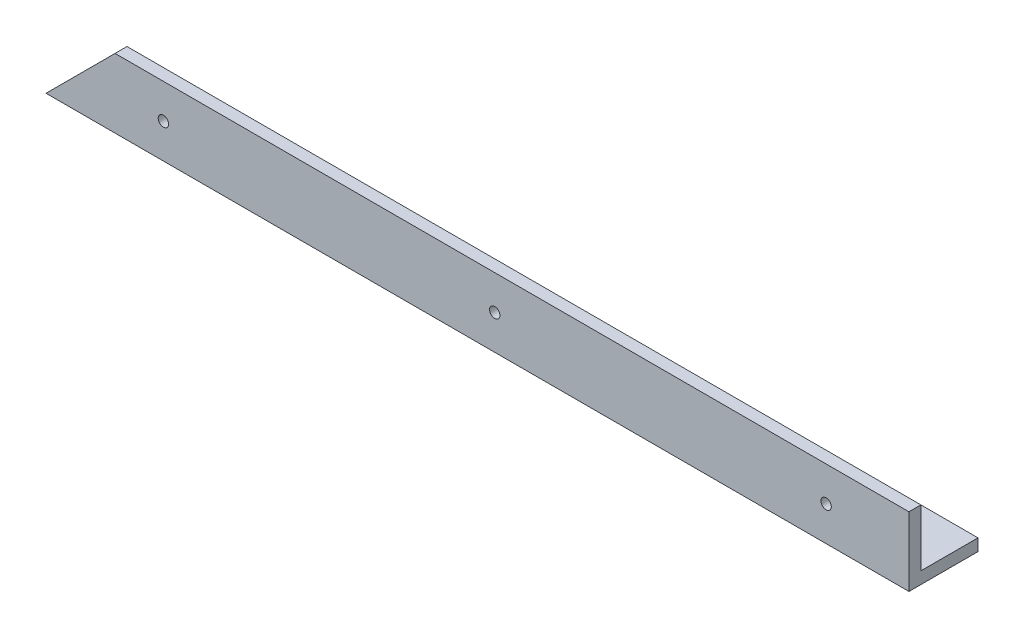
ISO-10303-21;
HEADER;
FILE_DESCRIPTION(('STEP AP214'),'2;1');
FILE_NAME('part.step','',(''),(''),'','','');
FILE_SCHEMA(('AUTOMOTIVE_DESIGN { 1 0 10303 214 1 1 1 1 }'));
ENDSEC;
DATA;
#1=APPLICATION_CONTEXT('core data for automotive mechanical design processes');
#2=APPLICATION_PROTOCOL_DEFINITION('international standard','automotive_design',2000,#1);
#3=PRODUCT_CONTEXT('',#1,'mechanical');
#4=PRODUCT('Part','Part','',(#3));
#5=PRODUCT_RELATED_PRODUCT_CATEGORY('part','',(#4));
#6=PRODUCT_DEFINITION_FORMATION('','',#4);
#7=PRODUCT_DEFINITION_CONTEXT('part definition',#1,'design');
#8=PRODUCT_DEFINITION('design','',#6,#7);
#9=PRODUCT_DEFINITION_SHAPE('','',#8);
#10=(LENGTH_UNIT() NAMED_UNIT(*) SI_UNIT(.MILLI.,.METRE.));
#11=(NAMED_UNIT(*) PLANE_ANGLE_UNIT() SI_UNIT($,.RADIAN.));
#12=(NAMED_UNIT(*) SI_UNIT($,.STERADIAN.) SOLID_ANGLE_UNIT());
#13=UNCERTAINTY_MEASURE_WITH_UNIT(LENGTH_MEASURE(1.E-05),#10,'distance_accuracy_value','');
#14=(GEOMETRIC_REPRESENTATION_CONTEXT(3) GLOBAL_UNCERTAINTY_ASSIGNED_CONTEXT((#13)) GLOBAL_UNIT_ASSIGNED_CONTEXT((#10,
#11,#12)) REPRESENTATION_CONTEXT('',''));
#15=CARTESIAN_POINT('',(0.,0.,0.));
#16=DIRECTION('',(0.,0.,1.));
#17=DIRECTION('',(1.,0.,0.));
#18=AXIS2_PLACEMENT_3D('',#15,#16,#17);
#19=CARTESIAN_POINT('',(250.,0.,-20.));
#20=DIRECTION('',(0.,0.,1.));
#21=DIRECTION('',(1.,0.,0.));
#22=AXIS2_PLACEMENT_3D('',#19,#20,#21);
#23=PLANE('',#22);
#24=DIRECTION('',(-1.,0.,0.));
#25=VECTOR('',#24,1.);
#26=CARTESIAN_POINT('',(250.,0.,-20.));
#27=LINE('',#26,#25);
#28=CARTESIAN_POINT('',(250.,0.,-20.));
#29=VERTEX_POINT('',#28);
#30=CARTESIAN_POINT('',(12.,0.,-20.));
#31=VERTEX_POINT('',#30);
#32=EDGE_CURVE('E107',#29,#31,#27,.T.);
#33=ORIENTED_EDGE('',*,*,#32,.T.);
#34=DIRECTION('',(0.,-1.,0.));
#35=VECTOR('',#34,1.);
#36=CARTESIAN_POINT('',(12.,20.,-20.));
#37=LINE('',#36,#35);
#38=CARTESIAN_POINT('',(12.,3.46117846701572,-20.));
#39=VERTEX_POINT('',#38);
#40=EDGE_CURVE('E94',#39,#31,#37,.T.);
#41=ORIENTED_EDGE('',*,*,#40,.F.);
#42=DIRECTION('',(-1.,0.,0.));
#43=VECTOR('',#42,1.);
#44=CARTESIAN_POINT('',(250.,3.46117846701572,-20.));
#45=LINE('',#44,#43);
#46=CARTESIAN_POINT('',(250.,3.46117846701572,-20.));
#47=VERTEX_POINT('',#46);
#48=EDGE_CURVE('E114',#47,#39,#45,.T.);
#49=ORIENTED_EDGE('',*,*,#48,.F.);
#50=DIRECTION('',(0.,1.,0.));
#51=VECTOR('',#50,1.);
#52=CARTESIAN_POINT('',(250.,0.,-20.));
#53=LINE('',#52,#51);
#54=EDGE_CURVE('E113',#29,#47,#53,.T.);
#55=ORIENTED_EDGE('',*,*,#54,.F.);
#56=EDGE_LOOP('',(#33,#41,#49,#55));
#57=FACE_BOUND('',#56,.T.);
#58=ADVANCED_FACE('F37',(#57),#23,.F.);
#59=CARTESIAN_POINT('',(250.,3.46117846701572,-20.));
#60=DIRECTION('',(0.,-1.,0.));
#61=DIRECTION('',(0.,0.,-1.));
#62=AXIS2_PLACEMENT_3D('',#59,#60,#61);
#63=PLANE('',#62);
#64=CARTESIAN_POINT('',(185.,3.46117846701572,-9.00000000000001));
#65=DIRECTION('',(0.,-1.,0.));
#66=DIRECTION('',(0.,0.,-1.));
#67=AXIS2_PLACEMENT_3D('',#64,#65,#66);
#68=CIRCLE('',#67,1.5);
#69=CARTESIAN_POINT('',(185.,3.46117846701572,-10.5));
#70=VERTEX_POINT('',#69);
#71=EDGE_CURVE('E184',#70,#70,#68,.T.);
#72=ORIENTED_EDGE('',*,*,#71,.T.);
#73=EDGE_LOOP('',(#72));
#74=FACE_BOUND('',#73,.T.);
#75=CARTESIAN_POINT('',(107.,3.46117846701572,-8.99999999999999));
#76=DIRECTION('',(0.,-1.,0.));
#77=DIRECTION('',(0.,0.,-1.));
#78=AXIS2_PLACEMENT_3D('',#75,#76,#77);
#79=CIRCLE('',#78,1.5);
#80=CARTESIAN_POINT('',(107.,3.46117846701572,-10.5));
#81=VERTEX_POINT('',#80);
#82=EDGE_CURVE('E193',#81,#81,#79,.T.);
#83=ORIENTED_EDGE('',*,*,#82,.T.);
#84=EDGE_LOOP('',(#83));
#85=FACE_BOUND('',#84,.T.);
#86=CARTESIAN_POINT('',(29.0000000000002,3.46117846701572,-8.99999999999999));
#87=DIRECTION('',(0.,-1.,0.));
#88=DIRECTION('',(0.,0.,-1.));
#89=AXIS2_PLACEMENT_3D('',#86,#87,#88);
#90=CIRCLE('',#89,1.5);
#91=CARTESIAN_POINT('',(29.0000000000002,3.46117846701572,-10.5));
#92=VERTEX_POINT('',#91);
#93=EDGE_CURVE('E197',#92,#92,#90,.T.);
#94=ORIENTED_EDGE('',*,*,#93,.T.);
#95=EDGE_LOOP('',(#94));
#96=FACE_BOUND('',#95,.T.);
#97=ORIENTED_EDGE('',*,*,#48,.T.);
#98=CARTESIAN_POINT('',(12.,3.46117846701572,-8.00000000000001));
#99=DIRECTION('',(0.,-1.,0.));
#100=DIRECTION('',(0.,0.,-1.));
#101=AXIS2_PLACEMENT_3D('',#98,#99,#100);
#102=CIRCLE('',#101,12.);
#103=CARTESIAN_POINT('',(3.46117846701574,3.46117846701572,-16.4314012375076));
#104=VERTEX_POINT('',#103);
#105=EDGE_CURVE('E97',#39,#104,#102,.F.);
#106=ORIENTED_EDGE('',*,*,#105,.T.);
#107=DIRECTION('',(0.,0.,-1.));
#108=VECTOR('',#107,1.);
#109=CARTESIAN_POINT('',(3.46117846701574,3.46117846701572,-20.));
#110=LINE('',#109,#108);
#111=CARTESIAN_POINT('',(3.4611784670157,3.46117846701571,-3.46117846701572));
#112=VERTEX_POINT('',#111);
#113=EDGE_CURVE('E125',#112,#104,#110,.T.);
#114=ORIENTED_EDGE('',*,*,#113,.F.);
#115=DIRECTION('',(-1.,0.,0.));
#116=VECTOR('',#115,1.);
#117=CARTESIAN_POINT('',(250.,3.46117846701572,-3.46117846701572));
#118=LINE('',#117,#116);
#119=CARTESIAN_POINT('',(250.,3.46117846701572,-3.46117846701572));
#120=VERTEX_POINT('',#119);
#121=EDGE_CURVE('E117',#120,#112,#118,.T.);
#122=ORIENTED_EDGE('',*,*,#121,.F.);
#123=DIRECTION('',(0.,0.,1.));
#124=VECTOR('',#123,1.);
#125=CARTESIAN_POINT('',(250.,3.46117846701572,-20.));
#126=LINE('',#125,#124);
#127=EDGE_CURVE('E157',#47,#120,#126,.T.);
#128=ORIENTED_EDGE('',*,*,#127,.F.);
#129=EDGE_LOOP('',(#97,#106,#114,#122,#128));
#130=FACE_BOUND('',#129,.T.);
#131=ADVANCED_FACE('F156',(#74,#85,#96,#130),#63,.F.);
#132=CARTESIAN_POINT('',(250.,20.,-3.46117846701572));
#133=DIRECTION('',(0.,-1.,0.));
#134=DIRECTION('',(0.,0.,-1.));
#135=AXIS2_PLACEMENT_3D('',#132,#133,#134);
#136=PLANE('',#135);
#137=DIRECTION('',(0.,0.,1.));
#138=VECTOR('',#137,1.);
#139=CARTESIAN_POINT('',(20.,20.,-20.));
#140=LINE('',#139,#138);
#141=CARTESIAN_POINT('',(20.,20.,-3.46117846701572));
#142=VERTEX_POINT('',#141);
#143=CARTESIAN_POINT('',(20.,20.,0.));
#144=VERTEX_POINT('',#143);
#145=EDGE_CURVE('E161',#142,#144,#140,.T.);
#146=ORIENTED_EDGE('',*,*,#145,.T.);
#147=DIRECTION('',(-1.,0.,0.));
#148=VECTOR('',#147,1.);
#149=CARTESIAN_POINT('',(250.,20.,0.));
#150=LINE('',#149,#148);
#151=CARTESIAN_POINT('',(250.,20.,0.));
#152=VERTEX_POINT('',#151);
#153=EDGE_CURVE('E138',#152,#144,#150,.T.);
#154=ORIENTED_EDGE('',*,*,#153,.F.);
#155=DIRECTION('',(0.,0.,1.));
#156=VECTOR('',#155,1.);
#157=CARTESIAN_POINT('',(250.,20.,-3.46117846701572));
#158=LINE('',#157,#156);
#159=CARTESIAN_POINT('',(250.,20.,-3.46117846701572));
#160=VERTEX_POINT('',#159);
#161=EDGE_CURVE('E59',#160,#152,#158,.T.);
#162=ORIENTED_EDGE('',*,*,#161,.F.);
#163=DIRECTION('',(-1.,0.,0.));
#164=VECTOR('',#163,1.);
#165=CARTESIAN_POINT('',(250.,20.,-3.46117846701572));
#166=LINE('',#165,#164);
#167=EDGE_CURVE('E141',#160,#142,#166,.T.);
#168=ORIENTED_EDGE('',*,*,#167,.T.);
#169=EDGE_LOOP('',(#146,#154,#162,#168));
#170=FACE_BOUND('',#169,.T.);
#171=ADVANCED_FACE('F170',(#170),#136,.F.);
#172=CARTESIAN_POINT('',(250.,20.,0.));
#173=DIRECTION('',(0.,0.,-1.));
#174=DIRECTION('',(0.,1.,0.));
#175=AXIS2_PLACEMENT_3D('',#172,#173,#174);
#176=PLANE('',#175);
#177=DIRECTION('',(-0.707106781186548,-0.707106781186547,0.));
#178=VECTOR('',#177,1.);
#179=CARTESIAN_POINT('',(20.,20.,0.));
#180=LINE('',#179,#178);
#181=CARTESIAN_POINT('',(0.,0.,0.));
#182=VERTEX_POINT('',#181);
#183=EDGE_CURVE('E176',#144,#182,#180,.T.);
#184=ORIENTED_EDGE('',*,*,#183,.T.);
#185=DIRECTION('',(-1.,0.,0.));
#186=VECTOR('',#185,1.);
#187=CARTESIAN_POINT('',(250.,0.,0.));
#188=LINE('',#187,#186);
#189=CARTESIAN_POINT('',(250.,0.,0.));
#190=VERTEX_POINT('',#189);
#191=EDGE_CURVE('E45',#190,#182,#188,.T.);
#192=ORIENTED_EDGE('',*,*,#191,.F.);
#193=DIRECTION('',(0.,-1.,0.));
#194=VECTOR('',#193,1.);
#195=CARTESIAN_POINT('',(250.,20.,0.));
#196=LINE('',#195,#194);
#197=EDGE_CURVE('E131',#152,#190,#196,.T.);
#198=ORIENTED_EDGE('',*,*,#197,.F.);
#199=ORIENTED_EDGE('',*,*,#153,.T.);
#200=EDGE_LOOP('',(#184,#192,#198,#199));
#201=FACE_BOUND('',#200,.T.);
#202=CARTESIAN_POINT('',(130.,10.,0.));
#203=DIRECTION('',(0.,0.,-1.));
#204=DIRECTION('',(-1.,0.,0.));
#205=AXIS2_PLACEMENT_3D('',#202,#203,#204);
#206=CIRCLE('',#205,1.5);
#207=CARTESIAN_POINT('',(128.5,10.,0.));
#208=VERTEX_POINT('',#207);
#209=EDGE_CURVE('E177',#208,#208,#206,.T.);
#210=ORIENTED_EDGE('',*,*,#209,.T.);
#211=EDGE_LOOP('',(#210));
#212=FACE_BOUND('',#211,.T.);
#213=CARTESIAN_POINT('',(34.,10.,0.));
#214=DIRECTION('',(0.,0.,-1.));
#215=DIRECTION('',(-1.,0.,0.));
#216=AXIS2_PLACEMENT_3D('',#213,#214,#215);
#217=CIRCLE('',#216,1.5);
#218=CARTESIAN_POINT('',(32.5,10.,0.));
#219=VERTEX_POINT('',#218);
#220=EDGE_CURVE('E181',#219,#219,#217,.T.);
#221=ORIENTED_EDGE('',*,*,#220,.T.);
#222=EDGE_LOOP('',(#221));
#223=FACE_BOUND('',#222,.T.);
#224=CARTESIAN_POINT('',(226.,10.,0.));
#225=DIRECTION('',(0.,0.,-1.));
#226=DIRECTION('',(-1.,0.,0.));
#227=AXIS2_PLACEMENT_3D('',#224,#225,#226);
#228=CIRCLE('',#227,1.5);
#229=CARTESIAN_POINT('',(224.5,10.,0.));
#230=VERTEX_POINT('',#229);
#231=EDGE_CURVE('E188',#230,#230,#228,.T.);
#232=ORIENTED_EDGE('',*,*,#231,.T.);
#233=EDGE_LOOP('',(#232));
#234=FACE_BOUND('',#233,.T.);
#235=ADVANCED_FACE('F39',(#201,#212,#223,#234),#176,.F.);
#236=CARTESIAN_POINT('',(250.,0.,0.));
#237=DIRECTION('',(0.,1.,0.));
#238=DIRECTION('',(0.,0.,1.));
#239=AXIS2_PLACEMENT_3D('',#236,#237,#238);
#240=PLANE('',#239);
#241=CARTESIAN_POINT('',(185.,0.,-9.00000000000001));
#242=DIRECTION('',(0.,-1.,0.));
#243=DIRECTION('',(0.,0.,-1.));
#244=AXIS2_PLACEMENT_3D('',#241,#242,#243);
#245=CIRCLE('',#244,1.5);
#246=CARTESIAN_POINT('',(185.,0.,-10.5));
#247=VERTEX_POINT('',#246);
#248=EDGE_CURVE('E111',#247,#247,#245,.T.);
#249=ORIENTED_EDGE('',*,*,#248,.F.);
#250=EDGE_LOOP('',(#249));
#251=FACE_BOUND('',#250,.T.);
#252=CARTESIAN_POINT('',(107.,0.,-8.99999999999999));
#253=DIRECTION('',(0.,-1.,0.));
#254=DIRECTION('',(0.,0.,-1.));
#255=AXIS2_PLACEMENT_3D('',#252,#253,#254);
#256=CIRCLE('',#255,1.5);
#257=CARTESIAN_POINT('',(107.,0.,-10.5));
#258=VERTEX_POINT('',#257);
#259=EDGE_CURVE('E207',#258,#258,#256,.T.);
#260=ORIENTED_EDGE('',*,*,#259,.F.);
#261=EDGE_LOOP('',(#260));
#262=FACE_BOUND('',#261,.T.);
#263=CARTESIAN_POINT('',(29.0000000000002,0.,-8.99999999999999));
#264=DIRECTION('',(0.,-1.,0.));
#265=DIRECTION('',(0.,0.,-1.));
#266=AXIS2_PLACEMENT_3D('',#263,#264,#265);
#267=CIRCLE('',#266,1.5);
#268=CARTESIAN_POINT('',(29.0000000000002,0.,-10.5));
#269=VERTEX_POINT('',#268);
#270=EDGE_CURVE('E204',#269,#269,#267,.T.);
#271=ORIENTED_EDGE('',*,*,#270,.F.);
#272=EDGE_LOOP('',(#271));
#273=FACE_BOUND('',#272,.T.);
#274=DIRECTION('',(0.,0.,-1.));
#275=VECTOR('',#274,1.);
#276=CARTESIAN_POINT('',(0.,0.,0.));
#277=LINE('',#276,#275);
#278=CARTESIAN_POINT('',(0.,0.,-8.));
#279=VERTEX_POINT('',#278);
#280=EDGE_CURVE('E110',#182,#279,#277,.T.);
#281=ORIENTED_EDGE('',*,*,#280,.T.);
#282=CARTESIAN_POINT('',(12.,0.,-8.00000000000001));
#283=DIRECTION('',(0.,1.,0.));
#284=DIRECTION('',(0.,0.,-1.));
#285=AXIS2_PLACEMENT_3D('',#282,#283,#284);
#286=CIRCLE('',#285,12.);
#287=EDGE_CURVE('E51',#31,#279,#286,.T.);
#288=ORIENTED_EDGE('',*,*,#287,.F.);
#289=ORIENTED_EDGE('',*,*,#32,.F.);
#290=DIRECTION('',(0.,0.,-1.));
#291=VECTOR('',#290,1.);
#292=CARTESIAN_POINT('',(250.,0.,0.));
#293=LINE('',#292,#291);
#294=EDGE_CURVE('E133',#190,#29,#293,.T.);
#295=ORIENTED_EDGE('',*,*,#294,.F.);
#296=ORIENTED_EDGE('',*,*,#191,.T.);
#297=EDGE_LOOP('',(#281,#288,#289,#295,#296));
#298=FACE_BOUND('',#297,.T.);
#299=ADVANCED_FACE('F106',(#251,#262,#273,#298),#240,.F.);
#300=CARTESIAN_POINT('',(250.,3.46117846701572,-3.46117846701572));
#301=DIRECTION('',(0.,0.,1.));
#302=DIRECTION('',(1.,0.,0.));
#303=AXIS2_PLACEMENT_3D('',#300,#301,#302);
#304=PLANE('',#303);
#305=DIRECTION('',(-0.707106781186548,-0.707106781186547,0.));
#306=VECTOR('',#305,1.);
#307=CARTESIAN_POINT('',(126.730589233508,126.730589233508,-3.46117846701572));
#308=LINE('',#307,#306);
#309=EDGE_CURVE('E151',#142,#112,#308,.T.);
#310=ORIENTED_EDGE('',*,*,#309,.F.);
#311=ORIENTED_EDGE('',*,*,#167,.F.);
#312=DIRECTION('',(0.,1.,0.));
#313=VECTOR('',#312,1.);
#314=CARTESIAN_POINT('',(250.,3.46117846701572,-3.46117846701572));
#315=LINE('',#314,#313);
#316=EDGE_CURVE('E152',#120,#160,#315,.T.);
#317=ORIENTED_EDGE('',*,*,#316,.F.);
#318=ORIENTED_EDGE('',*,*,#121,.T.);
#319=EDGE_LOOP('',(#310,#311,#317,#318));
#320=FACE_BOUND('',#319,.T.);
#321=CARTESIAN_POINT('',(130.,10.,-3.46117846701572));
#322=DIRECTION('',(0.,0.,1.));
#323=DIRECTION('',(1.,0.,0.));
#324=AXIS2_PLACEMENT_3D('',#321,#322,#323);
#325=CIRCLE('',#324,1.5);
#326=CARTESIAN_POINT('',(131.5,10.,-3.46117846701572));
#327=VERTEX_POINT('',#326);
#328=EDGE_CURVE('E127',#327,#327,#325,.F.);
#329=ORIENTED_EDGE('',*,*,#328,.F.);
#330=EDGE_LOOP('',(#329));
#331=FACE_BOUND('',#330,.T.);
#332=CARTESIAN_POINT('',(34.,10.,-3.46117846701572));
#333=DIRECTION('',(0.,0.,1.));
#334=DIRECTION('',(1.,0.,0.));
#335=AXIS2_PLACEMENT_3D('',#332,#333,#334);
#336=CIRCLE('',#335,1.5);
#337=CARTESIAN_POINT('',(35.5,10.,-3.46117846701572));
#338=VERTEX_POINT('',#337);
#339=EDGE_CURVE('E124',#338,#338,#336,.F.);
#340=ORIENTED_EDGE('',*,*,#339,.F.);
#341=EDGE_LOOP('',(#340));
#342=FACE_BOUND('',#341,.T.);
#343=CARTESIAN_POINT('',(226.,10.,-3.46117846701572));
#344=DIRECTION('',(0.,0.,1.));
#345=DIRECTION('',(1.,0.,0.));
#346=AXIS2_PLACEMENT_3D('',#343,#344,#345);
#347=CIRCLE('',#346,1.5);
#348=CARTESIAN_POINT('',(227.5,10.,-3.46117846701572));
#349=VERTEX_POINT('',#348);
#350=EDGE_CURVE('E121',#349,#349,#347,.F.);
#351=ORIENTED_EDGE('',*,*,#350,.F.);
#352=EDGE_LOOP('',(#351));
#353=FACE_BOUND('',#352,.T.);
#354=ADVANCED_FACE('F148',(#320,#331,#342,#353),#304,.F.);
#355=CARTESIAN_POINT('',(250.,0.,0.));
#356=DIRECTION('',(1.,0.,0.));
#357=DIRECTION('',(0.,0.,-1.));
#358=AXIS2_PLACEMENT_3D('',#355,#356,#357);
#359=PLANE('',#358);
#360=ORIENTED_EDGE('',*,*,#197,.T.);
#361=ORIENTED_EDGE('',*,*,#294,.T.);
#362=ORIENTED_EDGE('',*,*,#54,.T.);
#363=ORIENTED_EDGE('',*,*,#127,.T.);
#364=ORIENTED_EDGE('',*,*,#316,.T.);
#365=ORIENTED_EDGE('',*,*,#161,.T.);
#366=EDGE_LOOP('',(#360,#361,#362,#363,#364,#365));
#367=FACE_BOUND('',#366,.T.);
#368=ADVANCED_FACE('F167',(#367),#359,.T.);
#369=CARTESIAN_POINT('',(20.,20.,-20.));
#370=DIRECTION('',(-0.707106781186547,0.707106781186548,0.));
#371=DIRECTION('',(-0.707106781186548,-0.707106781186547,0.));
#372=AXIS2_PLACEMENT_3D('',#369,#370,#371);
#373=PLANE('',#372);
#374=CARTESIAN_POINT('',(12.,12.,-8.00000000000001));
#375=DIRECTION('',(-0.707106781186547,0.707106781186548,0.));
#376=DIRECTION('',(-0.707106781186548,-0.707106781186547,0.));
#377=AXIS2_PLACEMENT_3D('',#374,#375,#376);
#378=ELLIPSE('',#377,16.9705627484771,12.);
#379=EDGE_CURVE('E11',#279,#104,#378,.F.);
#380=ORIENTED_EDGE('',*,*,#379,.F.);
#381=ORIENTED_EDGE('',*,*,#280,.F.);
#382=ORIENTED_EDGE('',*,*,#183,.F.);
#383=ORIENTED_EDGE('',*,*,#145,.F.);
#384=ORIENTED_EDGE('',*,*,#309,.T.);
#385=ORIENTED_EDGE('',*,*,#113,.T.);
#386=EDGE_LOOP('',(#380,#381,#382,#383,#384,#385));
#387=FACE_BOUND('',#386,.T.);
#388=ADVANCED_FACE('F242',(#387),#373,.T.);
#389=CARTESIAN_POINT('',(226.,10.,-20.));
#390=DIRECTION('',(0.,0.,1.));
#391=DIRECTION('',(1.,0.,0.));
#392=AXIS2_PLACEMENT_3D('',#389,#390,#391);
#393=CYLINDRICAL_SURFACE('',#392,1.5);
#394=ORIENTED_EDGE('',*,*,#231,.F.);
#395=EDGE_LOOP('',(#394));
#396=FACE_BOUND('',#395,.T.);
#397=ORIENTED_EDGE('',*,*,#350,.T.);
#398=EDGE_LOOP('',(#397));
#399=FACE_BOUND('',#398,.T.);
#400=ADVANCED_FACE('F243',(#396,#399),#393,.F.);
#401=CARTESIAN_POINT('',(34.,10.,-20.));
#402=DIRECTION('',(0.,0.,1.));
#403=DIRECTION('',(1.,0.,0.));
#404=AXIS2_PLACEMENT_3D('',#401,#402,#403);
#405=CYLINDRICAL_SURFACE('',#404,1.5);
#406=ORIENTED_EDGE('',*,*,#220,.F.);
#407=EDGE_LOOP('',(#406));
#408=FACE_BOUND('',#407,.T.);
#409=ORIENTED_EDGE('',*,*,#339,.T.);
#410=EDGE_LOOP('',(#409));
#411=FACE_BOUND('',#410,.T.);
#412=ADVANCED_FACE('F246',(#408,#411),#405,.F.);
#413=CARTESIAN_POINT('',(130.,10.,-20.));
#414=DIRECTION('',(0.,0.,1.));
#415=DIRECTION('',(1.,0.,0.));
#416=AXIS2_PLACEMENT_3D('',#413,#414,#415);
#417=CYLINDRICAL_SURFACE('',#416,1.5);
#418=ORIENTED_EDGE('',*,*,#209,.F.);
#419=EDGE_LOOP('',(#418));
#420=FACE_BOUND('',#419,.T.);
#421=ORIENTED_EDGE('',*,*,#328,.T.);
#422=EDGE_LOOP('',(#421));
#423=FACE_BOUND('',#422,.T.);
#424=ADVANCED_FACE('F250',(#420,#423),#417,.F.);
#425=CARTESIAN_POINT('',(12.,20.,-8.00000000000001));
#426=DIRECTION('',(0.,-1.,0.));
#427=DIRECTION('',(0.,0.,-1.));
#428=AXIS2_PLACEMENT_3D('',#425,#426,#427);
#429=CYLINDRICAL_SURFACE('',#428,12.);
#430=ORIENTED_EDGE('',*,*,#40,.T.);
#431=ORIENTED_EDGE('',*,*,#287,.T.);
#432=ORIENTED_EDGE('',*,*,#379,.T.);
#433=ORIENTED_EDGE('',*,*,#105,.F.);
#434=EDGE_LOOP('',(#430,#431,#432,#433));
#435=FACE_BOUND('',#434,.T.);
#436=ADVANCED_FACE('F95',(#435),#429,.T.);
#437=CARTESIAN_POINT('',(29.0000000000002,20.,-8.99999999999999));
#438=DIRECTION('',(0.,-1.,0.));
#439=DIRECTION('',(0.,0.,-1.));
#440=AXIS2_PLACEMENT_3D('',#437,#438,#439);
#441=CYLINDRICAL_SURFACE('',#440,1.5);
#442=ORIENTED_EDGE('',*,*,#270,.T.);
#443=EDGE_LOOP('',(#442));
#444=FACE_BOUND('',#443,.T.);
#445=ORIENTED_EDGE('',*,*,#93,.F.);
#446=EDGE_LOOP('',(#445));
#447=FACE_BOUND('',#446,.T.);
#448=ADVANCED_FACE('F222',(#444,#447),#441,.F.);
#449=CARTESIAN_POINT('',(107.,20.,-8.99999999999999));
#450=DIRECTION('',(0.,-1.,0.));
#451=DIRECTION('',(0.,0.,-1.));
#452=AXIS2_PLACEMENT_3D('',#449,#450,#451);
#453=CYLINDRICAL_SURFACE('',#452,1.5);
#454=ORIENTED_EDGE('',*,*,#259,.T.);
#455=EDGE_LOOP('',(#454));
#456=FACE_BOUND('',#455,.T.);
#457=ORIENTED_EDGE('',*,*,#82,.F.);
#458=EDGE_LOOP('',(#457));
#459=FACE_BOUND('',#458,.T.);
#460=ADVANCED_FACE('F225',(#456,#459),#453,.F.);
#461=CARTESIAN_POINT('',(185.,20.,-9.00000000000001));
#462=DIRECTION('',(0.,-1.,0.));
#463=DIRECTION('',(0.,0.,-1.));
#464=AXIS2_PLACEMENT_3D('',#461,#462,#463);
#465=CYLINDRICAL_SURFACE('',#464,1.5);
#466=ORIENTED_EDGE('',*,*,#248,.T.);
#467=EDGE_LOOP('',(#466));
#468=FACE_BOUND('',#467,.T.);
#469=ORIENTED_EDGE('',*,*,#71,.F.);
#470=EDGE_LOOP('',(#469));
#471=FACE_BOUND('',#470,.T.);
#472=ADVANCED_FACE('F213',(#468,#471),#465,.F.);
#473=CLOSED_SHELL('',(#58,#131,#171,#235,#299,#354,#368,#388,#400,#412,#424,#436,#448,#460,#472));
#474=MANIFOLD_SOLID_BREP('B2',#473);
#475=ADVANCED_BREP_SHAPE_REPRESENTATION('',(#18,#474),#14);
#476=SHAPE_DEFINITION_REPRESENTATION(#9,#475);
ENDSEC;
END-ISO-10303-21;
